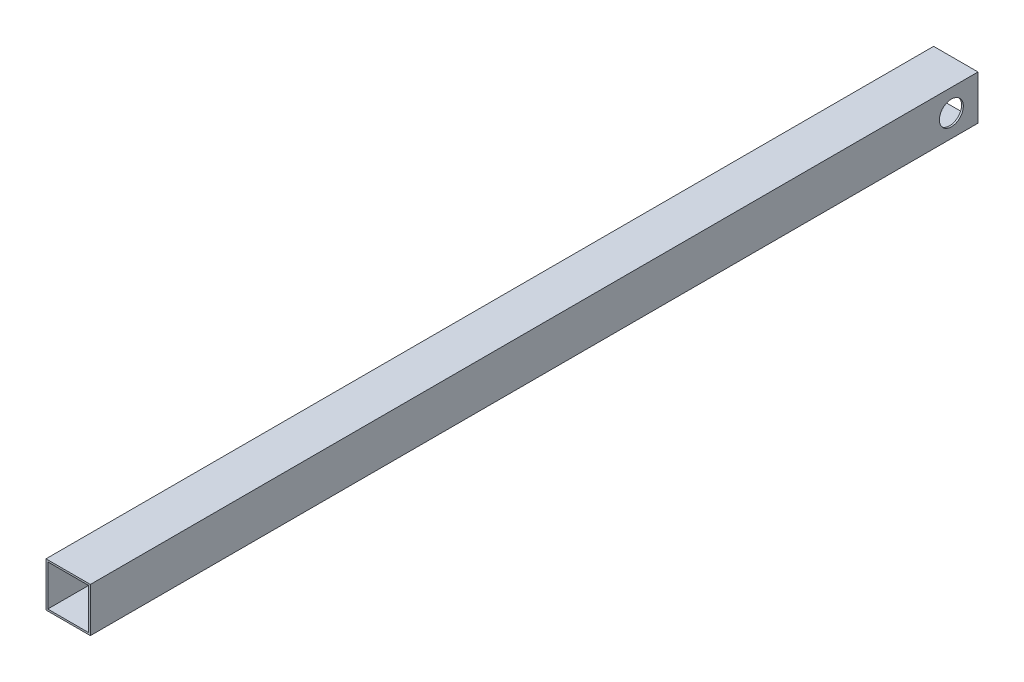
ISO-10303-21;
HEADER;
FILE_DESCRIPTION(('STEP AP214'),'2;1');
FILE_NAME('part.step','',(''),(''),'','','');
FILE_SCHEMA(('AUTOMOTIVE_DESIGN { 1 0 10303 214 1 1 1 1 }'));
ENDSEC;
DATA;
#1=APPLICATION_CONTEXT('core data for automotive mechanical design processes');
#2=APPLICATION_PROTOCOL_DEFINITION('international standard','automotive_design',2000,#1);
#3=PRODUCT_CONTEXT('',#1,'mechanical');
#4=PRODUCT('Part','Part','',(#3));
#5=PRODUCT_RELATED_PRODUCT_CATEGORY('part','',(#4));
#6=PRODUCT_DEFINITION_FORMATION('','',#4);
#7=PRODUCT_DEFINITION_CONTEXT('part definition',#1,'design');
#8=PRODUCT_DEFINITION('design','',#6,#7);
#9=PRODUCT_DEFINITION_SHAPE('','',#8);
#10=(LENGTH_UNIT() NAMED_UNIT(*) SI_UNIT(.MILLI.,.METRE.));
#11=(NAMED_UNIT(*) PLANE_ANGLE_UNIT() SI_UNIT($,.RADIAN.));
#12=(NAMED_UNIT(*) SI_UNIT($,.STERADIAN.) SOLID_ANGLE_UNIT());
#13=UNCERTAINTY_MEASURE_WITH_UNIT(LENGTH_MEASURE(1.E-05),#10,'distance_accuracy_value','');
#14=(GEOMETRIC_REPRESENTATION_CONTEXT(3) GLOBAL_UNCERTAINTY_ASSIGNED_CONTEXT((#13)) GLOBAL_UNIT_ASSIGNED_CONTEXT((#10,
#11,#12)) REPRESENTATION_CONTEXT('',''));
#15=CARTESIAN_POINT('',(0.,0.,0.));
#16=DIRECTION('',(0.,0.,1.));
#17=DIRECTION('',(1.,0.,0.));
#18=AXIS2_PLACEMENT_3D('',#15,#16,#17);
#19=CARTESIAN_POINT('',(12.5,12.5,500.));
#20=DIRECTION('',(-1.,0.,0.));
#21=DIRECTION('',(0.,-1.,0.));
#22=AXIS2_PLACEMENT_3D('',#19,#20,#21);
#23=PLANE('',#22);
#24=CARTESIAN_POINT('',(12.5,0.,15.));
#25=DIRECTION('',(1.,0.,0.));
#26=DIRECTION('',(0.,1.,0.));
#27=AXIS2_PLACEMENT_3D('',#24,#25,#26);
#28=CIRCLE('',#27,6.75);
#29=CARTESIAN_POINT('',(12.5,6.75,15.));
#30=VERTEX_POINT('',#29);
#31=EDGE_CURVE('E251',#30,#30,#28,.T.);
#32=ORIENTED_EDGE('',*,*,#31,.F.);
#33=EDGE_LOOP('',(#32));
#34=FACE_BOUND('',#33,.T.);
#35=DIRECTION('',(0.,1.,0.));
#36=VECTOR('',#35,1.);
#37=CARTESIAN_POINT('',(12.5,12.5,0.));
#38=LINE('',#37,#36);
#39=CARTESIAN_POINT('',(12.5,-12.5,0.));
#40=VERTEX_POINT('',#39);
#41=CARTESIAN_POINT('',(12.5,12.5,0.));
#42=VERTEX_POINT('',#41);
#43=EDGE_CURVE('E151',#40,#42,#38,.T.);
#44=ORIENTED_EDGE('',*,*,#43,.T.);
#45=DIRECTION('',(0.,0.,-1.));
#46=VECTOR('',#45,1.);
#47=CARTESIAN_POINT('',(12.5,12.5,500.));
#48=LINE('',#47,#46);
#49=CARTESIAN_POINT('',(12.5,12.5,500.));
#50=VERTEX_POINT('',#49);
#51=EDGE_CURVE('E11',#50,#42,#48,.T.);
#52=ORIENTED_EDGE('',*,*,#51,.F.);
#53=DIRECTION('',(0.,1.,0.));
#54=VECTOR('',#53,1.);
#55=CARTESIAN_POINT('',(12.5,12.5,500.));
#56=LINE('',#55,#54);
#57=CARTESIAN_POINT('',(12.5,-12.5,500.));
#58=VERTEX_POINT('',#57);
#59=EDGE_CURVE('E157',#58,#50,#56,.T.);
#60=ORIENTED_EDGE('',*,*,#59,.F.);
#61=DIRECTION('',(0.,0.,-1.));
#62=VECTOR('',#61,1.);
#63=CARTESIAN_POINT('',(12.5,-12.5,500.));
#64=LINE('',#63,#62);
#65=EDGE_CURVE('E171',#58,#40,#64,.T.);
#66=ORIENTED_EDGE('',*,*,#65,.T.);
#67=EDGE_LOOP('',(#44,#52,#60,#66));
#68=FACE_BOUND('',#67,.T.);
#69=ADVANCED_FACE('F39',(#34,#68),#23,.F.);
#70=CARTESIAN_POINT('',(-12.5,12.5,500.));
#71=DIRECTION('',(0.,-1.,0.));
#72=DIRECTION('',(0.,0.,-1.));
#73=AXIS2_PLACEMENT_3D('',#70,#71,#72);
#74=PLANE('',#73);
#75=DIRECTION('',(-1.,0.,0.));
#76=VECTOR('',#75,1.);
#77=CARTESIAN_POINT('',(-12.5,12.5,0.));
#78=LINE('',#77,#76);
#79=CARTESIAN_POINT('',(-12.5,12.5,0.));
#80=VERTEX_POINT('',#79);
#81=EDGE_CURVE('E175',#42,#80,#78,.T.);
#82=ORIENTED_EDGE('',*,*,#81,.T.);
#83=DIRECTION('',(0.,0.,-1.));
#84=VECTOR('',#83,1.);
#85=CARTESIAN_POINT('',(-12.5,12.5,500.));
#86=LINE('',#85,#84);
#87=CARTESIAN_POINT('',(-12.5,12.5,500.));
#88=VERTEX_POINT('',#87);
#89=EDGE_CURVE('E48',#88,#80,#86,.T.);
#90=ORIENTED_EDGE('',*,*,#89,.F.);
#91=DIRECTION('',(-1.,0.,0.));
#92=VECTOR('',#91,1.);
#93=CARTESIAN_POINT('',(-12.5,12.5,500.));
#94=LINE('',#93,#92);
#95=EDGE_CURVE('E161',#50,#88,#94,.T.);
#96=ORIENTED_EDGE('',*,*,#95,.F.);
#97=ORIENTED_EDGE('',*,*,#51,.T.);
#98=EDGE_LOOP('',(#82,#90,#96,#97));
#99=FACE_BOUND('',#98,.T.);
#100=ADVANCED_FACE('F210',(#99),#74,.F.);
#101=CARTESIAN_POINT('',(-12.5,12.5,500.));
#102=DIRECTION('',(1.,0.,0.));
#103=DIRECTION('',(0.,1.,0.));
#104=AXIS2_PLACEMENT_3D('',#101,#102,#103);
#105=PLANE('',#104);
#106=CARTESIAN_POINT('',(-12.5,0.,15.));
#107=DIRECTION('',(1.,0.,0.));
#108=DIRECTION('',(0.,1.,0.));
#109=AXIS2_PLACEMENT_3D('',#106,#107,#108);
#110=CIRCLE('',#109,6.75);
#111=CARTESIAN_POINT('',(-12.5,6.75,15.));
#112=VERTEX_POINT('',#111);
#113=EDGE_CURVE('E257',#112,#112,#110,.T.);
#114=ORIENTED_EDGE('',*,*,#113,.T.);
#115=EDGE_LOOP('',(#114));
#116=FACE_BOUND('',#115,.T.);
#117=DIRECTION('',(0.,-1.,0.));
#118=VECTOR('',#117,1.);
#119=CARTESIAN_POINT('',(-12.5,12.5,0.));
#120=LINE('',#119,#118);
#121=CARTESIAN_POINT('',(-12.5,-12.5,0.));
#122=VERTEX_POINT('',#121);
#123=EDGE_CURVE('E178',#80,#122,#120,.T.);
#124=ORIENTED_EDGE('',*,*,#123,.T.);
#125=DIRECTION('',(0.,0.,-1.));
#126=VECTOR('',#125,1.);
#127=CARTESIAN_POINT('',(-12.5,-12.5,500.));
#128=LINE('',#127,#126);
#129=CARTESIAN_POINT('',(-12.5,-12.5,500.));
#130=VERTEX_POINT('',#129);
#131=EDGE_CURVE('E186',#130,#122,#128,.T.);
#132=ORIENTED_EDGE('',*,*,#131,.F.);
#133=DIRECTION('',(0.,-1.,0.));
#134=VECTOR('',#133,1.);
#135=CARTESIAN_POINT('',(-12.5,12.5,500.));
#136=LINE('',#135,#134);
#137=EDGE_CURVE('E165',#88,#130,#136,.T.);
#138=ORIENTED_EDGE('',*,*,#137,.F.);
#139=ORIENTED_EDGE('',*,*,#89,.T.);
#140=EDGE_LOOP('',(#124,#132,#138,#139));
#141=FACE_BOUND('',#140,.T.);
#142=ADVANCED_FACE('F196',(#116,#141),#105,.F.);
#143=CARTESIAN_POINT('',(-12.5,-12.5,500.));
#144=DIRECTION('',(0.,1.,0.));
#145=DIRECTION('',(0.,0.,1.));
#146=AXIS2_PLACEMENT_3D('',#143,#144,#145);
#147=PLANE('',#146);
#148=DIRECTION('',(1.,0.,0.));
#149=VECTOR('',#148,1.);
#150=CARTESIAN_POINT('',(-12.5,-12.5,0.));
#151=LINE('',#150,#149);
#152=EDGE_CURVE('E162',#122,#40,#151,.T.);
#153=ORIENTED_EDGE('',*,*,#152,.T.);
#154=ORIENTED_EDGE('',*,*,#65,.F.);
#155=DIRECTION('',(1.,0.,0.));
#156=VECTOR('',#155,1.);
#157=CARTESIAN_POINT('',(-12.5,-12.5,500.));
#158=LINE('',#157,#156);
#159=EDGE_CURVE('E168',#130,#58,#158,.T.);
#160=ORIENTED_EDGE('',*,*,#159,.F.);
#161=ORIENTED_EDGE('',*,*,#131,.T.);
#162=EDGE_LOOP('',(#153,#154,#160,#161));
#163=FACE_BOUND('',#162,.T.);
#164=ADVANCED_FACE('F203',(#163),#147,.F.);
#165=CARTESIAN_POINT('',(0.,0.,500.));
#166=DIRECTION('',(0.,0.,1.));
#167=DIRECTION('',(1.,0.,0.));
#168=AXIS2_PLACEMENT_3D('',#165,#166,#167);
#169=PLANE('',#168);
#170=DIRECTION('',(0.,1.,0.));
#171=VECTOR('',#170,1.);
#172=CARTESIAN_POINT('',(11.5,11.5,500.));
#173=LINE('',#172,#171);
#174=CARTESIAN_POINT('',(11.5,-11.5,500.));
#175=VERTEX_POINT('',#174);
#176=CARTESIAN_POINT('',(11.5,11.5,500.));
#177=VERTEX_POINT('',#176);
#178=EDGE_CURVE('E55',#175,#177,#173,.T.);
#179=ORIENTED_EDGE('',*,*,#178,.F.);
#180=DIRECTION('',(1.,0.,0.));
#181=VECTOR('',#180,1.);
#182=CARTESIAN_POINT('',(-11.5,-11.5,500.));
#183=LINE('',#182,#181);
#184=CARTESIAN_POINT('',(-11.5,-11.5,500.));
#185=VERTEX_POINT('',#184);
#186=EDGE_CURVE('E126',#185,#175,#183,.T.);
#187=ORIENTED_EDGE('',*,*,#186,.F.);
#188=DIRECTION('',(0.,-1.,0.));
#189=VECTOR('',#188,1.);
#190=CARTESIAN_POINT('',(-11.5,11.5,500.));
#191=LINE('',#190,#189);
#192=CARTESIAN_POINT('',(-11.5,11.5,500.));
#193=VERTEX_POINT('',#192);
#194=EDGE_CURVE('E130',#193,#185,#191,.T.);
#195=ORIENTED_EDGE('',*,*,#194,.F.);
#196=DIRECTION('',(-1.,0.,0.));
#197=VECTOR('',#196,1.);
#198=CARTESIAN_POINT('',(-11.5,11.5,500.));
#199=LINE('',#198,#197);
#200=EDGE_CURVE('E142',#177,#193,#199,.T.);
#201=ORIENTED_EDGE('',*,*,#200,.F.);
#202=EDGE_LOOP('',(#179,#187,#195,#201));
#203=FACE_BOUND('',#202,.T.);
#204=ORIENTED_EDGE('',*,*,#59,.T.);
#205=ORIENTED_EDGE('',*,*,#95,.T.);
#206=ORIENTED_EDGE('',*,*,#137,.T.);
#207=ORIENTED_EDGE('',*,*,#159,.T.);
#208=EDGE_LOOP('',(#204,#205,#206,#207));
#209=FACE_BOUND('',#208,.T.);
#210=ADVANCED_FACE('F209',(#203,#209),#169,.T.);
#211=CARTESIAN_POINT('',(0.,0.,0.));
#212=DIRECTION('',(0.,0.,1.));
#213=DIRECTION('',(1.,0.,0.));
#214=AXIS2_PLACEMENT_3D('',#211,#212,#213);
#215=PLANE('',#214);
#216=DIRECTION('',(1.,0.,0.));
#217=VECTOR('',#216,1.);
#218=CARTESIAN_POINT('',(-11.5,-11.5,0.));
#219=LINE('',#218,#217);
#220=CARTESIAN_POINT('',(-11.5,-11.5,0.));
#221=VERTEX_POINT('',#220);
#222=CARTESIAN_POINT('',(11.5,-11.5,0.));
#223=VERTEX_POINT('',#222);
#224=EDGE_CURVE('E114',#221,#223,#219,.T.);
#225=ORIENTED_EDGE('',*,*,#224,.T.);
#226=DIRECTION('',(0.,1.,0.));
#227=VECTOR('',#226,1.);
#228=CARTESIAN_POINT('',(11.5,11.5,0.));
#229=LINE('',#228,#227);
#230=CARTESIAN_POINT('',(11.5,11.5,0.));
#231=VERTEX_POINT('',#230);
#232=EDGE_CURVE('E107',#223,#231,#229,.T.);
#233=ORIENTED_EDGE('',*,*,#232,.T.);
#234=DIRECTION('',(-1.,0.,0.));
#235=VECTOR('',#234,1.);
#236=CARTESIAN_POINT('',(-11.5,11.5,0.));
#237=LINE('',#236,#235);
#238=CARTESIAN_POINT('',(-11.5,11.5,0.));
#239=VERTEX_POINT('',#238);
#240=EDGE_CURVE('E117',#231,#239,#237,.T.);
#241=ORIENTED_EDGE('',*,*,#240,.T.);
#242=DIRECTION('',(0.,-1.,0.));
#243=VECTOR('',#242,1.);
#244=CARTESIAN_POINT('',(-11.5,11.5,0.));
#245=LINE('',#244,#243);
#246=EDGE_CURVE('E63',#239,#221,#245,.T.);
#247=ORIENTED_EDGE('',*,*,#246,.T.);
#248=EDGE_LOOP('',(#225,#233,#241,#247));
#249=FACE_BOUND('',#248,.T.);
#250=ORIENTED_EDGE('',*,*,#43,.F.);
#251=ORIENTED_EDGE('',*,*,#152,.F.);
#252=ORIENTED_EDGE('',*,*,#123,.F.);
#253=ORIENTED_EDGE('',*,*,#81,.F.);
#254=EDGE_LOOP('',(#250,#251,#252,#253));
#255=FACE_BOUND('',#254,.T.);
#256=ADVANCED_FACE('F122',(#249,#255),#215,.F.);
#257=CARTESIAN_POINT('',(11.5,11.5,0.));
#258=DIRECTION('',(1.,0.,0.));
#259=DIRECTION('',(0.,0.,-1.));
#260=AXIS2_PLACEMENT_3D('',#257,#258,#259);
#261=PLANE('',#260);
#262=CARTESIAN_POINT('',(11.5,0.,15.));
#263=DIRECTION('',(1.,0.,0.));
#264=DIRECTION('',(0.,0.,-1.));
#265=AXIS2_PLACEMENT_3D('',#262,#263,#264);
#266=CIRCLE('',#265,6.75);
#267=CARTESIAN_POINT('',(11.5,0.,8.25));
#268=VERTEX_POINT('',#267);
#269=EDGE_CURVE('E133',#268,#268,#266,.T.);
#270=ORIENTED_EDGE('',*,*,#269,.T.);
#271=EDGE_LOOP('',(#270));
#272=FACE_BOUND('',#271,.T.);
#273=ORIENTED_EDGE('',*,*,#178,.T.);
#274=DIRECTION('',(0.,0.,1.));
#275=VECTOR('',#274,1.);
#276=CARTESIAN_POINT('',(11.5,11.5,0.));
#277=LINE('',#276,#275);
#278=EDGE_CURVE('E103',#231,#177,#277,.T.);
#279=ORIENTED_EDGE('',*,*,#278,.F.);
#280=ORIENTED_EDGE('',*,*,#232,.F.);
#281=DIRECTION('',(0.,0.,1.));
#282=VECTOR('',#281,1.);
#283=CARTESIAN_POINT('',(11.5,-11.5,0.));
#284=LINE('',#283,#282);
#285=EDGE_CURVE('E148',#223,#175,#284,.T.);
#286=ORIENTED_EDGE('',*,*,#285,.T.);
#287=EDGE_LOOP('',(#273,#279,#280,#286));
#288=FACE_BOUND('',#287,.T.);
#289=ADVANCED_FACE('F105',(#272,#288),#261,.F.);
#290=CARTESIAN_POINT('',(-11.5,-11.5,0.));
#291=DIRECTION('',(0.,-1.,0.));
#292=DIRECTION('',(0.,0.,-1.));
#293=AXIS2_PLACEMENT_3D('',#290,#291,#292);
#294=PLANE('',#293);
#295=ORIENTED_EDGE('',*,*,#186,.T.);
#296=ORIENTED_EDGE('',*,*,#285,.F.);
#297=ORIENTED_EDGE('',*,*,#224,.F.);
#298=DIRECTION('',(0.,0.,1.));
#299=VECTOR('',#298,1.);
#300=CARTESIAN_POINT('',(-11.5,-11.5,0.));
#301=LINE('',#300,#299);
#302=EDGE_CURVE('E152',#221,#185,#301,.T.);
#303=ORIENTED_EDGE('',*,*,#302,.T.);
#304=EDGE_LOOP('',(#295,#296,#297,#303));
#305=FACE_BOUND('',#304,.T.);
#306=ADVANCED_FACE('F229',(#305),#294,.F.);
#307=CARTESIAN_POINT('',(-11.5,11.5,0.));
#308=DIRECTION('',(-1.,0.,0.));
#309=DIRECTION('',(0.,0.,1.));
#310=AXIS2_PLACEMENT_3D('',#307,#308,#309);
#311=PLANE('',#310);
#312=CARTESIAN_POINT('',(-11.5,0.,15.));
#313=DIRECTION('',(-1.,0.,0.));
#314=DIRECTION('',(0.,0.,1.));
#315=AXIS2_PLACEMENT_3D('',#312,#313,#314);
#316=CIRCLE('',#315,6.75);
#317=CARTESIAN_POINT('',(-11.5,0.,21.75));
#318=VERTEX_POINT('',#317);
#319=EDGE_CURVE('E42',#318,#318,#316,.T.);
#320=ORIENTED_EDGE('',*,*,#319,.T.);
#321=EDGE_LOOP('',(#320));
#322=FACE_BOUND('',#321,.T.);
#323=ORIENTED_EDGE('',*,*,#194,.T.);
#324=ORIENTED_EDGE('',*,*,#302,.F.);
#325=ORIENTED_EDGE('',*,*,#246,.F.);
#326=DIRECTION('',(0.,0.,1.));
#327=VECTOR('',#326,1.);
#328=CARTESIAN_POINT('',(-11.5,11.5,0.));
#329=LINE('',#328,#327);
#330=EDGE_CURVE('E113',#239,#193,#329,.T.);
#331=ORIENTED_EDGE('',*,*,#330,.T.);
#332=EDGE_LOOP('',(#323,#324,#325,#331));
#333=FACE_BOUND('',#332,.T.);
#334=ADVANCED_FACE('F234',(#322,#333),#311,.F.);
#335=CARTESIAN_POINT('',(-11.5,11.5,0.));
#336=DIRECTION('',(0.,1.,0.));
#337=DIRECTION('',(0.,0.,1.));
#338=AXIS2_PLACEMENT_3D('',#335,#336,#337);
#339=PLANE('',#338);
#340=ORIENTED_EDGE('',*,*,#200,.T.);
#341=ORIENTED_EDGE('',*,*,#330,.F.);
#342=ORIENTED_EDGE('',*,*,#240,.F.);
#343=ORIENTED_EDGE('',*,*,#278,.T.);
#344=EDGE_LOOP('',(#340,#341,#342,#343));
#345=FACE_BOUND('',#344,.T.);
#346=ADVANCED_FACE('F118',(#345),#339,.F.);
#347=CARTESIAN_POINT('',(-12.5,0.,15.));
#348=DIRECTION('',(1.,0.,0.));
#349=DIRECTION('',(0.,1.,0.));
#350=AXIS2_PLACEMENT_3D('',#347,#348,#349);
#351=CYLINDRICAL_SURFACE('',#350,6.75);
#352=ORIENTED_EDGE('',*,*,#113,.F.);
#353=EDGE_LOOP('',(#352));
#354=FACE_BOUND('',#353,.T.);
#355=ORIENTED_EDGE('',*,*,#319,.F.);
#356=EDGE_LOOP('',(#355));
#357=FACE_BOUND('',#356,.T.);
#358=ADVANCED_FACE('F233',(#354,#357),#351,.F.);
#359=ORIENTED_EDGE('',*,*,#31,.T.);
#360=EDGE_LOOP('',(#359));
#361=FACE_BOUND('',#360,.T.);
#362=ORIENTED_EDGE('',*,*,#269,.F.);
#363=EDGE_LOOP('',(#362));
#364=FACE_BOUND('',#363,.T.);
#365=ADVANCED_FACE('F241',(#361,#364),#351,.F.);
#366=CLOSED_SHELL('',(#69,#100,#142,#164,#210,#256,#289,#306,#334,#346,#358,#365));
#367=MANIFOLD_SOLID_BREP('B2',#366);
#368=ADVANCED_BREP_SHAPE_REPRESENTATION('',(#18,#367),#14);
#369=SHAPE_DEFINITION_REPRESENTATION(#9,#368);
ENDSEC;
END-ISO-10303-21;
